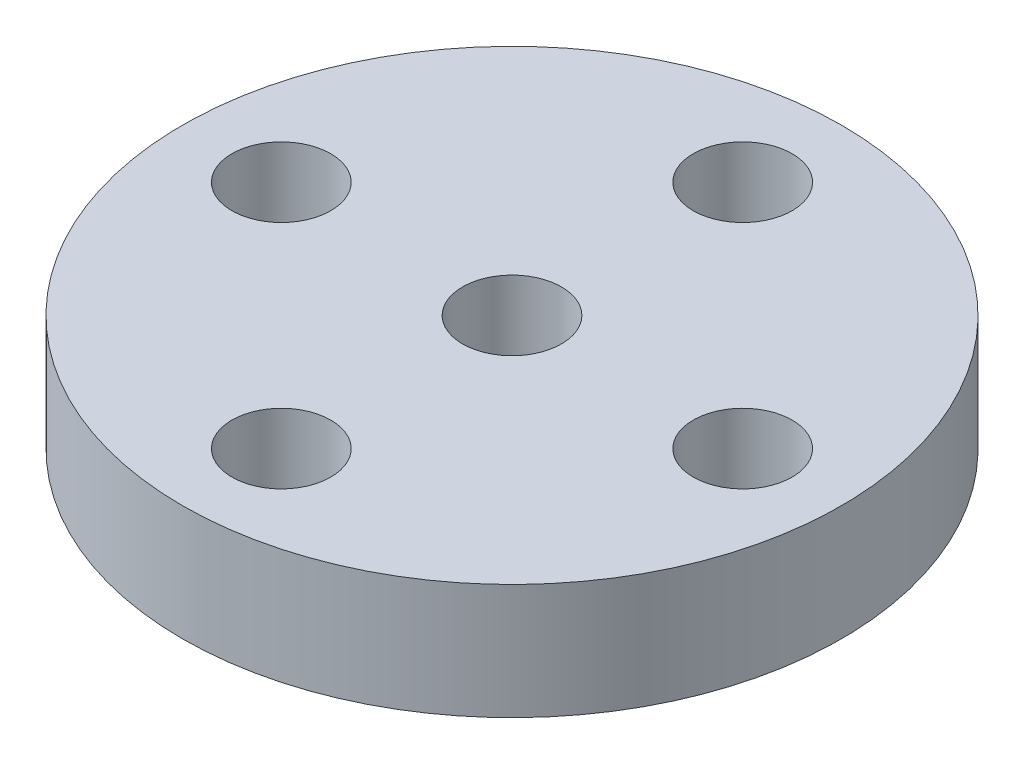
ISO-10303-21;
HEADER;
FILE_DESCRIPTION(('STEP AP214'),'2;1');
FILE_NAME('part.step','',(''),(''),'','','');
FILE_SCHEMA(('AUTOMOTIVE_DESIGN { 1 0 10303 214 1 1 1 1 }'));
ENDSEC;
DATA;
#1=APPLICATION_CONTEXT('core data for automotive mechanical design processes');
#2=APPLICATION_PROTOCOL_DEFINITION('international standard','automotive_design',2000,#1);
#3=PRODUCT_CONTEXT('',#1,'mechanical');
#4=PRODUCT('Part','Part','',(#3));
#5=PRODUCT_RELATED_PRODUCT_CATEGORY('part','',(#4));
#6=PRODUCT_DEFINITION_FORMATION('','',#4);
#7=PRODUCT_DEFINITION_CONTEXT('part definition',#1,'design');
#8=PRODUCT_DEFINITION('design','',#6,#7);
#9=PRODUCT_DEFINITION_SHAPE('','',#8);
#10=(LENGTH_UNIT() NAMED_UNIT(*) SI_UNIT(.MILLI.,.METRE.));
#11=(NAMED_UNIT(*) PLANE_ANGLE_UNIT() SI_UNIT($,.RADIAN.));
#12=(NAMED_UNIT(*) SI_UNIT($,.STERADIAN.) SOLID_ANGLE_UNIT());
#13=UNCERTAINTY_MEASURE_WITH_UNIT(LENGTH_MEASURE(1.E-05),#10,'distance_accuracy_value','');
#14=(GEOMETRIC_REPRESENTATION_CONTEXT(3) GLOBAL_UNCERTAINTY_ASSIGNED_CONTEXT((#13)) GLOBAL_UNIT_ASSIGNED_CONTEXT((#10,
#11,#12)) REPRESENTATION_CONTEXT('',''));
#15=CARTESIAN_POINT('',(0.,0.,0.));
#16=DIRECTION('',(0.,0.,1.));
#17=DIRECTION('',(1.,0.,0.));
#18=AXIS2_PLACEMENT_3D('',#15,#16,#17);
#19=CARTESIAN_POINT('',(0.,3.5,0.));
#20=DIRECTION('',(0.,1.,0.));
#21=DIRECTION('',(0.,0.,1.));
#22=AXIS2_PLACEMENT_3D('',#19,#20,#21);
#23=PLANE('',#22);
#24=CARTESIAN_POINT('',(0.,3.5,7.));
#25=DIRECTION('',(0.,1.,0.));
#26=DIRECTION('',(0.,0.,-1.));
#27=AXIS2_PLACEMENT_3D('',#24,#25,#26);
#28=CIRCLE('',#27,1.5);
#29=CARTESIAN_POINT('',(0.,3.5,5.5));
#30=VERTEX_POINT('',#29);
#31=EDGE_CURVE('E76',#30,#30,#28,.T.);
#32=ORIENTED_EDGE('',*,*,#31,.F.);
#33=EDGE_LOOP('',(#32));
#34=FACE_BOUND('',#33,.T.);
#35=CARTESIAN_POINT('',(7.,3.5,0.));
#36=DIRECTION('',(0.,1.,0.));
#37=DIRECTION('',(0.,0.,1.));
#38=AXIS2_PLACEMENT_3D('',#35,#36,#37);
#39=CIRCLE('',#38,1.5);
#40=CARTESIAN_POINT('',(7.,3.5,1.5));
#41=VERTEX_POINT('',#40);
#42=EDGE_CURVE('E60',#41,#41,#39,.T.);
#43=ORIENTED_EDGE('',*,*,#42,.F.);
#44=EDGE_LOOP('',(#43));
#45=FACE_BOUND('',#44,.T.);
#46=CARTESIAN_POINT('',(0.,3.5,0.));
#47=DIRECTION('',(0.,1.,0.));
#48=DIRECTION('',(0.,0.,1.));
#49=AXIS2_PLACEMENT_3D('',#46,#47,#48);
#50=CIRCLE('',#49,10.);
#51=CARTESIAN_POINT('',(0.,3.5,10.));
#52=VERTEX_POINT('',#51);
#53=EDGE_CURVE('E10',#52,#52,#50,.T.);
#54=ORIENTED_EDGE('',*,*,#53,.T.);
#55=EDGE_LOOP('',(#54));
#56=FACE_BOUND('',#55,.T.);
#57=CARTESIAN_POINT('',(0.,3.5,-7.));
#58=DIRECTION('',(0.,1.,0.));
#59=DIRECTION('',(0.,0.,1.));
#60=AXIS2_PLACEMENT_3D('',#57,#58,#59);
#61=CIRCLE('',#60,1.5);
#62=CARTESIAN_POINT('',(0.,3.5,-5.5));
#63=VERTEX_POINT('',#62);
#64=EDGE_CURVE('E54',#63,#63,#61,.T.);
#65=ORIENTED_EDGE('',*,*,#64,.F.);
#66=EDGE_LOOP('',(#65));
#67=FACE_BOUND('',#66,.T.);
#68=CARTESIAN_POINT('',(0.,3.5,0.));
#69=DIRECTION('',(0.,1.,0.));
#70=DIRECTION('',(0.,0.,1.));
#71=AXIS2_PLACEMENT_3D('',#68,#69,#70);
#72=CIRCLE('',#71,1.5);
#73=CARTESIAN_POINT('',(0.,3.5,1.5));
#74=VERTEX_POINT('',#73);
#75=EDGE_CURVE('E68',#74,#74,#72,.T.);
#76=ORIENTED_EDGE('',*,*,#75,.F.);
#77=EDGE_LOOP('',(#76));
#78=FACE_BOUND('',#77,.T.);
#79=CARTESIAN_POINT('',(-7.,3.5,0.));
#80=DIRECTION('',(0.,1.,0.));
#81=DIRECTION('',(0.,0.,-1.));
#82=AXIS2_PLACEMENT_3D('',#79,#80,#81);
#83=CIRCLE('',#82,1.5);
#84=CARTESIAN_POINT('',(-7.,3.5,-1.5));
#85=VERTEX_POINT('',#84);
#86=EDGE_CURVE('E84',#85,#85,#83,.T.);
#87=ORIENTED_EDGE('',*,*,#86,.F.);
#88=EDGE_LOOP('',(#87));
#89=FACE_BOUND('',#88,.T.);
#90=ADVANCED_FACE('F41',(#34,#45,#56,#67,#78,#89),#23,.T.);
#91=CARTESIAN_POINT('',(0.,0.,0.));
#92=DIRECTION('',(0.,1.,0.));
#93=DIRECTION('',(0.,0.,1.));
#94=AXIS2_PLACEMENT_3D('',#91,#92,#93);
#95=PLANE('',#94);
#96=CARTESIAN_POINT('',(0.,0.,0.));
#97=DIRECTION('',(0.,1.,0.));
#98=DIRECTION('',(0.,0.,1.));
#99=AXIS2_PLACEMENT_3D('',#96,#97,#98);
#100=CIRCLE('',#99,10.);
#101=CARTESIAN_POINT('',(0.,0.,10.));
#102=VERTEX_POINT('',#101);
#103=EDGE_CURVE('E45',#102,#102,#100,.T.);
#104=ORIENTED_EDGE('',*,*,#103,.F.);
#105=EDGE_LOOP('',(#104));
#106=FACE_BOUND('',#105,.T.);
#107=CARTESIAN_POINT('',(0.,0.,-7.));
#108=DIRECTION('',(0.,1.,0.));
#109=DIRECTION('',(0.,0.,1.));
#110=AXIS2_PLACEMENT_3D('',#107,#108,#109);
#111=CIRCLE('',#110,1.5);
#112=CARTESIAN_POINT('',(0.,0.,-5.5));
#113=VERTEX_POINT('',#112);
#114=EDGE_CURVE('E56',#113,#113,#111,.T.);
#115=ORIENTED_EDGE('',*,*,#114,.T.);
#116=EDGE_LOOP('',(#115));
#117=FACE_BOUND('',#116,.T.);
#118=CARTESIAN_POINT('',(7.,0.,0.));
#119=DIRECTION('',(0.,1.,0.));
#120=DIRECTION('',(0.,0.,1.));
#121=AXIS2_PLACEMENT_3D('',#118,#119,#120);
#122=CIRCLE('',#121,1.5);
#123=CARTESIAN_POINT('',(7.,0.,1.5));
#124=VERTEX_POINT('',#123);
#125=EDGE_CURVE('E64',#124,#124,#122,.T.);
#126=ORIENTED_EDGE('',*,*,#125,.T.);
#127=EDGE_LOOP('',(#126));
#128=FACE_BOUND('',#127,.T.);
#129=CARTESIAN_POINT('',(0.,0.,0.));
#130=DIRECTION('',(0.,1.,0.));
#131=DIRECTION('',(0.,0.,1.));
#132=AXIS2_PLACEMENT_3D('',#129,#130,#131);
#133=CIRCLE('',#132,1.5);
#134=CARTESIAN_POINT('',(0.,0.,1.5));
#135=VERTEX_POINT('',#134);
#136=EDGE_CURVE('E72',#135,#135,#133,.T.);
#137=ORIENTED_EDGE('',*,*,#136,.T.);
#138=EDGE_LOOP('',(#137));
#139=FACE_BOUND('',#138,.T.);
#140=CARTESIAN_POINT('',(0.,0.,7.));
#141=DIRECTION('',(0.,1.,0.));
#142=DIRECTION('',(0.,0.,-1.));
#143=AXIS2_PLACEMENT_3D('',#140,#141,#142);
#144=CIRCLE('',#143,1.5);
#145=CARTESIAN_POINT('',(0.,0.,5.5));
#146=VERTEX_POINT('',#145);
#147=EDGE_CURVE('E80',#146,#146,#144,.T.);
#148=ORIENTED_EDGE('',*,*,#147,.T.);
#149=EDGE_LOOP('',(#148));
#150=FACE_BOUND('',#149,.T.);
#151=CARTESIAN_POINT('',(-7.,0.,0.));
#152=DIRECTION('',(0.,1.,0.));
#153=DIRECTION('',(0.,0.,-1.));
#154=AXIS2_PLACEMENT_3D('',#151,#152,#153);
#155=CIRCLE('',#154,1.5);
#156=CARTESIAN_POINT('',(-7.,0.,-1.5));
#157=VERTEX_POINT('',#156);
#158=EDGE_CURVE('E88',#157,#157,#155,.T.);
#159=ORIENTED_EDGE('',*,*,#158,.T.);
#160=EDGE_LOOP('',(#159));
#161=FACE_BOUND('',#160,.T.);
#162=ADVANCED_FACE('F100',(#106,#117,#128,#139,#150,#161),#95,.F.);
#163=CARTESIAN_POINT('',(0.,3.5,0.));
#164=DIRECTION('',(0.,-1.,0.));
#165=DIRECTION('',(0.,0.,-1.));
#166=AXIS2_PLACEMENT_3D('',#163,#164,#165);
#167=CYLINDRICAL_SURFACE('',#166,10.);
#168=ORIENTED_EDGE('',*,*,#53,.F.);
#169=EDGE_LOOP('',(#168));
#170=FACE_BOUND('',#169,.T.);
#171=ORIENTED_EDGE('',*,*,#103,.T.);
#172=EDGE_LOOP('',(#171));
#173=FACE_BOUND('',#172,.T.);
#174=ADVANCED_FACE('F43',(#170,#173),#167,.T.);
#175=CARTESIAN_POINT('',(0.,3.5,-7.));
#176=DIRECTION('',(0.,-1.,0.));
#177=DIRECTION('',(0.,0.,-1.));
#178=AXIS2_PLACEMENT_3D('',#175,#176,#177);
#179=CYLINDRICAL_SURFACE('',#178,1.5);
#180=ORIENTED_EDGE('',*,*,#64,.T.);
#181=EDGE_LOOP('',(#180));
#182=FACE_BOUND('',#181,.T.);
#183=ORIENTED_EDGE('',*,*,#114,.F.);
#184=EDGE_LOOP('',(#183));
#185=FACE_BOUND('',#184,.T.);
#186=ADVANCED_FACE('F110',(#182,#185),#179,.F.);
#187=CARTESIAN_POINT('',(7.,3.5,0.));
#188=DIRECTION('',(0.,-1.,0.));
#189=DIRECTION('',(0.,0.,-1.));
#190=AXIS2_PLACEMENT_3D('',#187,#188,#189);
#191=CYLINDRICAL_SURFACE('',#190,1.5);
#192=ORIENTED_EDGE('',*,*,#42,.T.);
#193=EDGE_LOOP('',(#192));
#194=FACE_BOUND('',#193,.T.);
#195=ORIENTED_EDGE('',*,*,#125,.F.);
#196=EDGE_LOOP('',(#195));
#197=FACE_BOUND('',#196,.T.);
#198=ADVANCED_FACE('F113',(#194,#197),#191,.F.);
#199=CARTESIAN_POINT('',(0.,3.5,0.));
#200=DIRECTION('',(0.,-1.,0.));
#201=DIRECTION('',(0.,0.,-1.));
#202=AXIS2_PLACEMENT_3D('',#199,#200,#201);
#203=CYLINDRICAL_SURFACE('',#202,1.5);
#204=ORIENTED_EDGE('',*,*,#75,.T.);
#205=EDGE_LOOP('',(#204));
#206=FACE_BOUND('',#205,.T.);
#207=ORIENTED_EDGE('',*,*,#136,.F.);
#208=EDGE_LOOP('',(#207));
#209=FACE_BOUND('',#208,.T.);
#210=ADVANCED_FACE('F117',(#206,#209),#203,.F.);
#211=CARTESIAN_POINT('',(0.,3.5,7.));
#212=DIRECTION('',(0.,-1.,0.));
#213=DIRECTION('',(0.,0.,-1.));
#214=AXIS2_PLACEMENT_3D('',#211,#212,#213);
#215=CYLINDRICAL_SURFACE('',#214,1.5);
#216=ORIENTED_EDGE('',*,*,#31,.T.);
#217=EDGE_LOOP('',(#216));
#218=FACE_BOUND('',#217,.T.);
#219=ORIENTED_EDGE('',*,*,#147,.F.);
#220=EDGE_LOOP('',(#219));
#221=FACE_BOUND('',#220,.T.);
#222=ADVANCED_FACE('F121',(#218,#221),#215,.F.);
#223=CARTESIAN_POINT('',(-7.,3.5,0.));
#224=DIRECTION('',(0.,-1.,0.));
#225=DIRECTION('',(0.,0.,-1.));
#226=AXIS2_PLACEMENT_3D('',#223,#224,#225);
#227=CYLINDRICAL_SURFACE('',#226,1.5);
#228=ORIENTED_EDGE('',*,*,#86,.T.);
#229=EDGE_LOOP('',(#228));
#230=FACE_BOUND('',#229,.T.);
#231=ORIENTED_EDGE('',*,*,#158,.F.);
#232=EDGE_LOOP('',(#231));
#233=FACE_BOUND('',#232,.T.);
#234=ADVANCED_FACE('F96',(#230,#233),#227,.F.);
#235=CLOSED_SHELL('',(#90,#162,#174,#186,#198,#210,#222,#234));
#236=MANIFOLD_SOLID_BREP('B2',#235);
#237=ADVANCED_BREP_SHAPE_REPRESENTATION('',(#18,#236),#14);
#238=SHAPE_DEFINITION_REPRESENTATION(#9,#237);
ENDSEC;
END-ISO-10303-21;
